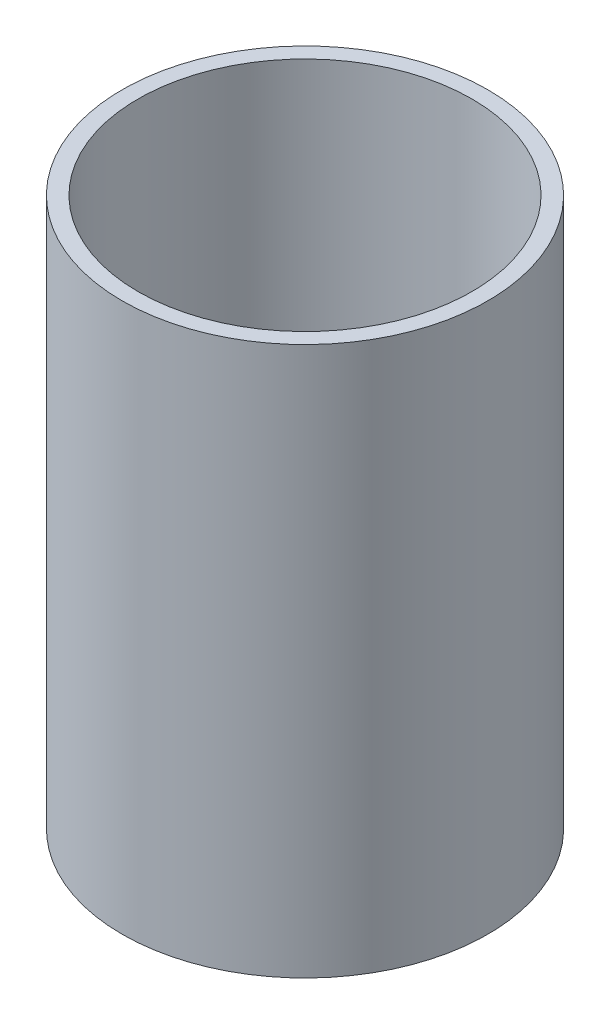
ISO-10303-21;
HEADER;
FILE_DESCRIPTION(('STEP AP214'),'2;1');
FILE_NAME('part.step','',(''),(''),'','','');
FILE_SCHEMA(('AUTOMOTIVE_DESIGN { 1 0 10303 214 1 1 1 1 }'));
ENDSEC;
DATA;
#1=APPLICATION_CONTEXT('core data for automotive mechanical design processes');
#2=APPLICATION_PROTOCOL_DEFINITION('international standard','automotive_design',2000,#1);
#3=PRODUCT_CONTEXT('',#1,'mechanical');
#4=PRODUCT('Part','Part','',(#3));
#5=PRODUCT_RELATED_PRODUCT_CATEGORY('part','',(#4));
#6=PRODUCT_DEFINITION_FORMATION('','',#4);
#7=PRODUCT_DEFINITION_CONTEXT('part definition',#1,'design');
#8=PRODUCT_DEFINITION('design','',#6,#7);
#9=PRODUCT_DEFINITION_SHAPE('','',#8);
#10=(LENGTH_UNIT() NAMED_UNIT(*) SI_UNIT(.MILLI.,.METRE.));
#11=(NAMED_UNIT(*) PLANE_ANGLE_UNIT() SI_UNIT($,.RADIAN.));
#12=(NAMED_UNIT(*) SI_UNIT($,.STERADIAN.) SOLID_ANGLE_UNIT());
#13=UNCERTAINTY_MEASURE_WITH_UNIT(LENGTH_MEASURE(1.E-05),#10,'distance_accuracy_value','');
#14=(GEOMETRIC_REPRESENTATION_CONTEXT(3) GLOBAL_UNCERTAINTY_ASSIGNED_CONTEXT((#13)) GLOBAL_UNIT_ASSIGNED_CONTEXT((#10,
#11,#12)) REPRESENTATION_CONTEXT('',''));
#15=CARTESIAN_POINT('',(0.,0.,0.));
#16=DIRECTION('',(0.,0.,1.));
#17=DIRECTION('',(1.,0.,0.));
#18=AXIS2_PLACEMENT_3D('',#15,#16,#17);
#19=CARTESIAN_POINT('',(-54.4068797322574,35.,-32.341546364894));
#20=DIRECTION('',(0.,1.,0.));
#21=DIRECTION('',(0.,0.,1.));
#22=AXIS2_PLACEMENT_3D('',#19,#20,#21);
#23=PLANE('',#22);
#24=CARTESIAN_POINT('',(-54.4068797322574,35.,-32.341546364894));
#25=DIRECTION('',(0.,1.,0.));
#26=DIRECTION('',(0.,0.,1.));
#27=AXIS2_PLACEMENT_3D('',#24,#25,#26);
#28=CIRCLE('',#27,11.6660000000001);
#29=CARTESIAN_POINT('',(-54.4068797322574,35.,-20.6755463648939));
#30=VERTEX_POINT('',#29);
#31=EDGE_CURVE('E10',#30,#30,#28,.T.);
#32=ORIENTED_EDGE('',*,*,#31,.T.);
#33=EDGE_LOOP('',(#32));
#34=FACE_BOUND('',#33,.T.);
#35=CARTESIAN_POINT('',(-54.4068797322574,35.,-32.341546364894));
#36=DIRECTION('',(0.,1.,0.));
#37=DIRECTION('',(0.,0.,1.));
#38=AXIS2_PLACEMENT_3D('',#35,#36,#37);
#39=CIRCLE('',#38,10.6500000000001);
#40=CARTESIAN_POINT('',(-54.4068797322574,35.,-21.6915463648939));
#41=VERTEX_POINT('',#40);
#42=EDGE_CURVE('E41',#41,#41,#39,.T.);
#43=ORIENTED_EDGE('',*,*,#42,.F.);
#44=EDGE_LOOP('',(#43));
#45=FACE_BOUND('',#44,.T.);
#46=ADVANCED_FACE('F30',(#34,#45),#23,.T.);
#47=CARTESIAN_POINT('',(-54.4068797322574,0.,-32.341546364894));
#48=DIRECTION('',(0.,1.,0.));
#49=DIRECTION('',(0.,0.,1.));
#50=AXIS2_PLACEMENT_3D('',#47,#48,#49);
#51=PLANE('',#50);
#52=CARTESIAN_POINT('',(-54.4068797322574,0.,-32.341546364894));
#53=DIRECTION('',(0.,1.,0.));
#54=DIRECTION('',(0.,0.,1.));
#55=AXIS2_PLACEMENT_3D('',#52,#53,#54);
#56=CIRCLE('',#55,11.6660000000001);
#57=CARTESIAN_POINT('',(-54.4068797322574,0.,-20.6755463648939));
#58=VERTEX_POINT('',#57);
#59=EDGE_CURVE('E34',#58,#58,#56,.T.);
#60=ORIENTED_EDGE('',*,*,#59,.F.);
#61=EDGE_LOOP('',(#60));
#62=FACE_BOUND('',#61,.T.);
#63=CARTESIAN_POINT('',(-54.4068797322574,0.,-32.341546364894));
#64=DIRECTION('',(0.,1.,0.));
#65=DIRECTION('',(0.,0.,1.));
#66=AXIS2_PLACEMENT_3D('',#63,#64,#65);
#67=CIRCLE('',#66,10.6500000000001);
#68=CARTESIAN_POINT('',(-54.4068797322574,0.,-21.6915463648939));
#69=VERTEX_POINT('',#68);
#70=EDGE_CURVE('E43',#69,#69,#67,.T.);
#71=ORIENTED_EDGE('',*,*,#70,.T.);
#72=EDGE_LOOP('',(#71));
#73=FACE_BOUND('',#72,.T.);
#74=ADVANCED_FACE('F53',(#62,#73),#51,.F.);
#75=CARTESIAN_POINT('',(-54.4068797322574,35.,-32.341546364894));
#76=DIRECTION('',(0.,-1.,0.));
#77=DIRECTION('',(0.,0.,-1.));
#78=AXIS2_PLACEMENT_3D('',#75,#76,#77);
#79=CYLINDRICAL_SURFACE('',#78,11.6660000000001);
#80=ORIENTED_EDGE('',*,*,#31,.F.);
#81=EDGE_LOOP('',(#80));
#82=FACE_BOUND('',#81,.T.);
#83=ORIENTED_EDGE('',*,*,#59,.T.);
#84=EDGE_LOOP('',(#83));
#85=FACE_BOUND('',#84,.T.);
#86=ADVANCED_FACE('F32',(#82,#85),#79,.T.);
#87=CARTESIAN_POINT('',(-54.4068797322574,35.,-32.341546364894));
#88=DIRECTION('',(0.,-1.,0.));
#89=DIRECTION('',(0.,0.,-1.));
#90=AXIS2_PLACEMENT_3D('',#87,#88,#89);
#91=CYLINDRICAL_SURFACE('',#90,10.6500000000001);
#92=ORIENTED_EDGE('',*,*,#42,.T.);
#93=EDGE_LOOP('',(#92));
#94=FACE_BOUND('',#93,.T.);
#95=ORIENTED_EDGE('',*,*,#70,.F.);
#96=EDGE_LOOP('',(#95));
#97=FACE_BOUND('',#96,.T.);
#98=ADVANCED_FACE('F49',(#94,#97),#91,.F.);
#99=CLOSED_SHELL('',(#46,#74,#86,#98));
#100=MANIFOLD_SOLID_BREP('B2',#99);
#101=ADVANCED_BREP_SHAPE_REPRESENTATION('',(#18,#100),#14);
#102=SHAPE_DEFINITION_REPRESENTATION(#9,#101);
ENDSEC;
END-ISO-10303-21;
